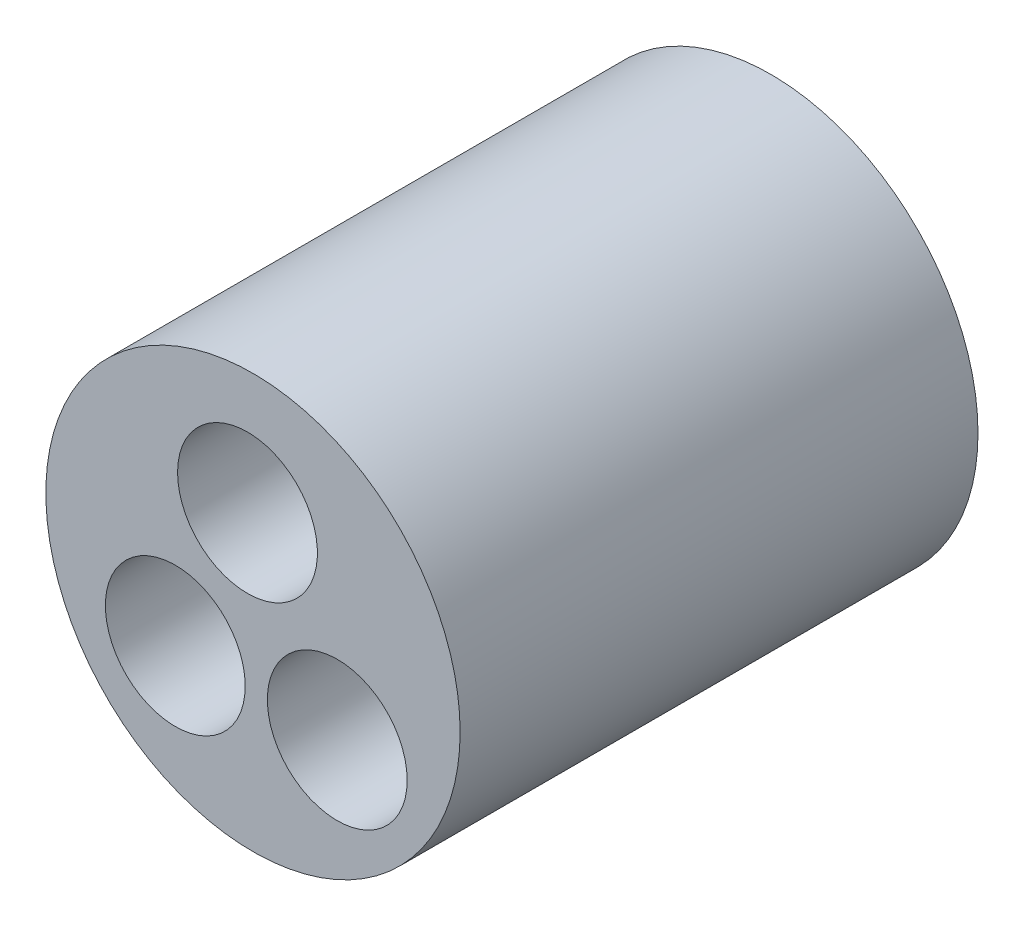
ISO-10303-21;
HEADER;
FILE_DESCRIPTION(('STEP AP214'),'2;1');
FILE_NAME('part.step','',(''),(''),'','','');
FILE_SCHEMA(('AUTOMOTIVE_DESIGN { 1 0 10303 214 1 1 1 1 }'));
ENDSEC;
DATA;
#1=APPLICATION_CONTEXT('core data for automotive mechanical design processes');
#2=APPLICATION_PROTOCOL_DEFINITION('international standard','automotive_design',2000,#1);
#3=PRODUCT_CONTEXT('',#1,'mechanical');
#4=PRODUCT('Part','Part','',(#3));
#5=PRODUCT_RELATED_PRODUCT_CATEGORY('part','',(#4));
#6=PRODUCT_DEFINITION_FORMATION('','',#4);
#7=PRODUCT_DEFINITION_CONTEXT('part definition',#1,'design');
#8=PRODUCT_DEFINITION('design','',#6,#7);
#9=PRODUCT_DEFINITION_SHAPE('','',#8);
#10=(LENGTH_UNIT() NAMED_UNIT(*) SI_UNIT(.MILLI.,.METRE.));
#11=(NAMED_UNIT(*) PLANE_ANGLE_UNIT() SI_UNIT($,.RADIAN.));
#12=(NAMED_UNIT(*) SI_UNIT($,.STERADIAN.) SOLID_ANGLE_UNIT());
#13=UNCERTAINTY_MEASURE_WITH_UNIT(LENGTH_MEASURE(1.E-05),#10,'distance_accuracy_value','');
#14=(GEOMETRIC_REPRESENTATION_CONTEXT(3) GLOBAL_UNCERTAINTY_ASSIGNED_CONTEXT((#13)) GLOBAL_UNIT_ASSIGNED_CONTEXT((#10,
#11,#12)) REPRESENTATION_CONTEXT('',''));
#15=CARTESIAN_POINT('',(0.,0.,0.));
#16=DIRECTION('',(0.,0.,1.));
#17=DIRECTION('',(1.,0.,0.));
#18=AXIS2_PLACEMENT_3D('',#15,#16,#17);
#19=CARTESIAN_POINT('',(7.5799606373721,0.,5.2));
#20=DIRECTION('',(0.,0.,-1.));
#21=DIRECTION('',(-1.,0.,0.));
#22=AXIS2_PLACEMENT_3D('',#19,#20,#21);
#23=CYLINDRICAL_SURFACE('',#22,2.75);
#24=CARTESIAN_POINT('',(7.5799606373721,0.,5.2));
#25=DIRECTION('',(0.,0.,-1.));
#26=DIRECTION('',(-1.,0.,0.));
#27=AXIS2_PLACEMENT_3D('',#24,#25,#26);
#28=CIRCLE('',#27,2.75);
#29=CARTESIAN_POINT('',(8.63379057536218,-2.54006741284475,5.2));
#30=VERTEX_POINT('',#29);
#31=CARTESIAN_POINT('',(6.57938547184493,-2.56151309544384,5.2));
#32=VERTEX_POINT('',#31);
#33=EDGE_CURVE('E129',#30,#32,#28,.T.);
#34=ORIENTED_EDGE('',*,*,#33,.F.);
#35=DIRECTION('',(0.,0.,1.));
#36=VECTOR('',#35,1.);
#37=CARTESIAN_POINT('',(8.63379057536218,-2.54006741284475,5.));
#38=LINE('',#37,#36);
#39=CARTESIAN_POINT('',(8.63379057536218,-2.54006741284475,0.));
#40=VERTEX_POINT('',#39);
#41=EDGE_CURVE('E113',#30,#40,#38,.F.);
#42=ORIENTED_EDGE('',*,*,#41,.T.);
#43=CARTESIAN_POINT('',(7.5799606373721,0.,0.));
#44=DIRECTION('',(0.,0.,-1.));
#45=DIRECTION('',(-1.,0.,0.));
#46=AXIS2_PLACEMENT_3D('',#43,#44,#45);
#47=CIRCLE('',#46,2.75);
#48=CARTESIAN_POINT('',(6.57938547184493,-2.56151309544384,0.));
#49=VERTEX_POINT('',#48);
#50=EDGE_CURVE('E122',#40,#49,#47,.T.);
#51=ORIENTED_EDGE('',*,*,#50,.T.);
#52=DIRECTION('',(0.,0.,1.));
#53=VECTOR('',#52,1.);
#54=CARTESIAN_POINT('',(6.57938547184493,-2.56151309544384,5.));
#55=LINE('',#54,#53);
#56=EDGE_CURVE('E165',#49,#32,#55,.T.);
#57=ORIENTED_EDGE('',*,*,#56,.T.);
#58=EDGE_LOOP('',(#34,#42,#51,#57));
#59=FACE_BOUND('',#58,.T.);
#60=ADVANCED_FACE('F33',(#59),#23,.F.);
#61=CARTESIAN_POINT('',(7.5799606373721,0.,5.2));
#62=DIRECTION('',(0.,0.,-1.));
#63=DIRECTION('',(-1.,0.,0.));
#64=AXIS2_PLACEMENT_3D('',#61,#62,#63);
#65=PLANE('',#64);
#66=CARTESIAN_POINT('',(9.20753202698421,-1.31805237746644,5.2));
#67=DIRECTION('',(0.,0.,-1.));
#68=DIRECTION('',(-1.,0.,0.));
#69=AXIS2_PLACEMENT_3D('',#66,#67,#68);
#70=CIRCLE('',#69,1.35);
#71=CARTESIAN_POINT('',(9.77793122812153,-0.0944737116905464,5.2));
#72=VERTEX_POINT('',#71);
#73=CARTESIAN_POINT('',(10.283598535764,-0.502834082356185,5.2));
#74=VERTEX_POINT('',#73);
#75=EDGE_CURVE('E108',#72,#74,#70,.T.);
#76=ORIENTED_EDGE('',*,*,#75,.F.);
#77=CARTESIAN_POINT('',(7.5799606373721,0.,5.2));
#78=DIRECTION('',(0.,0.,-1.));
#79=DIRECTION('',(-1.,0.,0.));
#80=AXIS2_PLACEMENT_3D('',#77,#78,#79);
#81=CIRCLE('',#80,2.2);
#82=CARTESIAN_POINT('',(5.38506632164342,-0.149796337678694,5.2));
#83=VERTEX_POINT('',#82);
#84=EDGE_CURVE('E177',#83,#72,#81,.T.);
#85=ORIENTED_EDGE('',*,*,#84,.F.);
#86=CARTESIAN_POINT('',(6.07959594488605,-1.30743557441804,5.2));
#87=DIRECTION('',(0.,0.,-1.));
#88=DIRECTION('',(-1.,0.,0.));
#89=AXIS2_PLACEMENT_3D('',#86,#87,#88);
#90=CIRCLE('',#89,1.35);
#91=CARTESIAN_POINT('',(4.90566473646909,-0.640813104121164,5.2));
#92=VERTEX_POINT('',#91);
#93=EDGE_CURVE('E164',#92,#83,#90,.T.);
#94=ORIENTED_EDGE('',*,*,#93,.F.);
#95=EDGE_CURVE('E131',#92,#74,#28,.T.);
#96=ORIENTED_EDGE('',*,*,#95,.T.);
#97=EDGE_LOOP('',(#76,#85,#94,#96));
#98=FACE_BOUND('',#97,.T.);
#99=ADVANCED_FACE('F221',(#98),#65,.T.);
#100=CARTESIAN_POINT('',(7.5799606373721,0.,6.2));
#101=DIRECTION('',(0.,0.,-1.));
#102=DIRECTION('',(-1.,0.,0.));
#103=AXIS2_PLACEMENT_3D('',#100,#101,#102);
#104=CYLINDRICAL_SURFACE('',#103,2.2);
#105=CARTESIAN_POINT('',(7.5799606373721,0.,6.2));
#106=DIRECTION('',(0.,0.,-1.));
#107=DIRECTION('',(-1.,0.,0.));
#108=AXIS2_PLACEMENT_3D('',#105,#106,#107);
#109=CIRCLE('',#108,2.2);
#110=CARTESIAN_POINT('',(8.12924131918393,-2.1303264380344,6.2));
#111=VERTEX_POINT('',#110);
#112=CARTESIAN_POINT('',(7.13135907884184,-2.15377729621338,6.2));
#113=VERTEX_POINT('',#112);
#114=EDGE_CURVE('E152',#111,#113,#109,.T.);
#115=ORIENTED_EDGE('',*,*,#114,.F.);
#116=DIRECTION('',(0.,0.,1.));
#117=VECTOR('',#116,1.);
#118=CARTESIAN_POINT('',(8.12924131918393,-2.1303264380344,5.));
#119=LINE('',#118,#117);
#120=CARTESIAN_POINT('',(8.12924131918393,-2.1303264380344,5.2));
#121=VERTEX_POINT('',#120);
#122=EDGE_CURVE('E47',#111,#121,#119,.F.);
#123=ORIENTED_EDGE('',*,*,#122,.T.);
#124=CARTESIAN_POINT('',(7.13135907884184,-2.15377729621338,5.2));
#125=VERTEX_POINT('',#124);
#126=EDGE_CURVE('E154',#121,#125,#81,.T.);
#127=ORIENTED_EDGE('',*,*,#126,.T.);
#128=DIRECTION('',(0.,0.,1.));
#129=VECTOR('',#128,1.);
#130=CARTESIAN_POINT('',(7.13135907884184,-2.15377729621338,5.));
#131=LINE('',#130,#129);
#132=EDGE_CURVE('E145',#125,#113,#131,.T.);
#133=ORIENTED_EDGE('',*,*,#132,.T.);
#134=EDGE_LOOP('',(#115,#123,#127,#133));
#135=FACE_BOUND('',#134,.T.);
#136=ADVANCED_FACE('F151',(#135),#104,.F.);
#137=CARTESIAN_POINT('',(7.5799606373721,0.,10.));
#138=DIRECTION('',(0.,0.,-1.));
#139=DIRECTION('',(-1.,0.,0.));
#140=AXIS2_PLACEMENT_3D('',#137,#138,#139);
#141=CYLINDRICAL_SURFACE('',#140,4.);
#142=CARTESIAN_POINT('',(7.5799606373721,0.,10.));
#143=DIRECTION('',(0.,0.,1.));
#144=DIRECTION('',(1.,0.,0.));
#145=AXIS2_PLACEMENT_3D('',#142,#143,#144);
#146=CIRCLE('',#145,4.);
#147=CARTESIAN_POINT('',(11.5799606373721,0.,10.));
#148=VERTEX_POINT('',#147);
#149=EDGE_CURVE('E136',#148,#148,#146,.T.);
#150=ORIENTED_EDGE('',*,*,#149,.F.);
#151=EDGE_LOOP('',(#150));
#152=FACE_BOUND('',#151,.T.);
#153=CARTESIAN_POINT('',(7.5799606373721,0.,0.));
#154=DIRECTION('',(0.,0.,1.));
#155=DIRECTION('',(1.,0.,0.));
#156=AXIS2_PLACEMENT_3D('',#153,#154,#155);
#157=CIRCLE('',#156,4.);
#158=CARTESIAN_POINT('',(11.5799606373721,0.,0.));
#159=VERTEX_POINT('',#158);
#160=EDGE_CURVE('E139',#159,#159,#157,.T.);
#161=ORIENTED_EDGE('',*,*,#160,.T.);
#162=EDGE_LOOP('',(#161));
#163=FACE_BOUND('',#162,.T.);
#164=ADVANCED_FACE('F35',(#152,#163),#141,.T.);
#165=CARTESIAN_POINT('',(7.5799606373721,0.,10.));
#166=DIRECTION('',(0.,0.,1.));
#167=DIRECTION('',(1.,0.,0.));
#168=AXIS2_PLACEMENT_3D('',#165,#166,#167);
#169=PLANE('',#168);
#170=CARTESIAN_POINT('',(9.20753202698421,-1.31805237746644,10.));
#171=DIRECTION('',(0.,0.,1.));
#172=DIRECTION('',(1.,0.,0.));
#173=AXIS2_PLACEMENT_3D('',#170,#171,#172);
#174=CIRCLE('',#173,1.35);
#175=CARTESIAN_POINT('',(10.5575320269842,-1.31805237746644,10.));
#176=VERTEX_POINT('',#175);
#177=EDGE_CURVE('E124',#176,#176,#174,.T.);
#178=ORIENTED_EDGE('',*,*,#177,.F.);
#179=EDGE_LOOP('',(#178));
#180=FACE_BOUND('',#179,.T.);
#181=CARTESIAN_POINT('',(6.07959594488605,-1.30743557441804,10.));
#182=DIRECTION('',(0.,0.,1.));
#183=DIRECTION('',(1.,0.,0.));
#184=AXIS2_PLACEMENT_3D('',#181,#182,#183);
#185=CIRCLE('',#184,1.35);
#186=CARTESIAN_POINT('',(7.42959594488605,-1.30743557441804,10.));
#187=VERTEX_POINT('',#186);
#188=EDGE_CURVE('E159',#187,#187,#185,.T.);
#189=ORIENTED_EDGE('',*,*,#188,.F.);
#190=EDGE_LOOP('',(#189));
#191=FACE_BOUND('',#190,.T.);
#192=CARTESIAN_POINT('',(7.47360329768658,1.61562642074773,10.));
#193=DIRECTION('',(0.,0.,-1.));
#194=DIRECTION('',(-1.,0.,0.));
#195=AXIS2_PLACEMENT_3D('',#192,#193,#194);
#196=CIRCLE('',#195,1.35);
#197=CARTESIAN_POINT('',(6.12360329768658,1.61562642074773,10.));
#198=VERTEX_POINT('',#197);
#199=EDGE_CURVE('E170',#198,#198,#196,.T.);
#200=ORIENTED_EDGE('',*,*,#199,.T.);
#201=EDGE_LOOP('',(#200));
#202=FACE_BOUND('',#201,.T.);
#203=ORIENTED_EDGE('',*,*,#149,.T.);
#204=EDGE_LOOP('',(#203));
#205=FACE_BOUND('',#204,.T.);
#206=ADVANCED_FACE('F202',(#180,#191,#202,#205),#169,.T.);
#207=CARTESIAN_POINT('',(7.5799606373721,0.,0.));
#208=DIRECTION('',(0.,0.,1.));
#209=DIRECTION('',(1.,0.,0.));
#210=AXIS2_PLACEMENT_3D('',#207,#208,#209);
#211=PLANE('',#210);
#212=ORIENTED_EDGE('',*,*,#50,.F.);
#213=CARTESIAN_POINT('',(9.20753202698421,-1.31805237746644,0.));
#214=DIRECTION('',(0.,0.,1.));
#215=DIRECTION('',(1.,0.,0.));
#216=AXIS2_PLACEMENT_3D('',#213,#214,#215);
#217=CIRCLE('',#216,1.35);
#218=CARTESIAN_POINT('',(10.283598535764,-0.502834082356185,0.));
#219=VERTEX_POINT('',#218);
#220=EDGE_CURVE('E105',#40,#219,#217,.T.);
#221=ORIENTED_EDGE('',*,*,#220,.T.);
#222=CARTESIAN_POINT('',(4.90566473646909,-0.640813104121164,0.));
#223=VERTEX_POINT('',#222);
#224=EDGE_CURVE('E121',#223,#219,#47,.T.);
#225=ORIENTED_EDGE('',*,*,#224,.F.);
#226=CARTESIAN_POINT('',(6.07959594488605,-1.30743557441804,0.));
#227=DIRECTION('',(0.,0.,1.));
#228=DIRECTION('',(1.,0.,0.));
#229=AXIS2_PLACEMENT_3D('',#226,#227,#228);
#230=CIRCLE('',#229,1.35);
#231=EDGE_CURVE('E155',#223,#49,#230,.T.);
#232=ORIENTED_EDGE('',*,*,#231,.T.);
#233=EDGE_LOOP('',(#212,#221,#225,#232));
#234=FACE_BOUND('',#233,.T.);
#235=ORIENTED_EDGE('',*,*,#160,.F.);
#236=EDGE_LOOP('',(#235));
#237=FACE_BOUND('',#236,.T.);
#238=ADVANCED_FACE('F118',(#234,#237),#211,.F.);
#239=ORIENTED_EDGE('',*,*,#224,.T.);
#240=DIRECTION('',(0.,0.,1.));
#241=VECTOR('',#240,1.);
#242=CARTESIAN_POINT('',(10.283598535764,-0.502834082356185,5.));
#243=LINE('',#242,#241);
#244=EDGE_CURVE('E102',#219,#74,#243,.T.);
#245=ORIENTED_EDGE('',*,*,#244,.T.);
#246=ORIENTED_EDGE('',*,*,#95,.F.);
#247=DIRECTION('',(0.,0.,1.));
#248=VECTOR('',#247,1.);
#249=CARTESIAN_POINT('',(4.90566473646909,-0.640813104121164,5.));
#250=LINE('',#249,#248);
#251=EDGE_CURVE('E128',#92,#223,#250,.F.);
#252=ORIENTED_EDGE('',*,*,#251,.T.);
#253=EDGE_LOOP('',(#239,#245,#246,#252));
#254=FACE_BOUND('',#253,.T.);
#255=ADVANCED_FACE('F127',(#254),#23,.F.);
#256=EDGE_CURVE('E191',#30,#121,#70,.T.);
#257=ORIENTED_EDGE('',*,*,#256,.F.);
#258=ORIENTED_EDGE('',*,*,#33,.T.);
#259=EDGE_CURVE('E157',#125,#32,#90,.T.);
#260=ORIENTED_EDGE('',*,*,#259,.F.);
#261=ORIENTED_EDGE('',*,*,#126,.F.);
#262=EDGE_LOOP('',(#257,#258,#260,#261));
#263=FACE_BOUND('',#262,.T.);
#264=ADVANCED_FACE('F218',(#263),#65,.T.);
#265=ORIENTED_EDGE('',*,*,#84,.T.);
#266=DIRECTION('',(0.,0.,1.));
#267=VECTOR('',#266,1.);
#268=CARTESIAN_POINT('',(9.77793122812153,-0.0944737116905469,5.));
#269=LINE('',#268,#267);
#270=CARTESIAN_POINT('',(9.77793122812153,-0.094473711690547,6.2));
#271=VERTEX_POINT('',#270);
#272=EDGE_CURVE('E123',#72,#271,#269,.T.);
#273=ORIENTED_EDGE('',*,*,#272,.T.);
#274=CARTESIAN_POINT('',(8.80711947662306,1.82594665399848,6.2));
#275=VERTEX_POINT('',#274);
#276=EDGE_CURVE('E176',#275,#271,#109,.T.);
#277=ORIENTED_EDGE('',*,*,#276,.F.);
#278=CARTESIAN_POINT('',(6.12402376343064,1.6493173797355,6.2));
#279=VERTEX_POINT('',#278);
#280=EDGE_CURVE('E133',#279,#275,#109,.T.);
#281=ORIENTED_EDGE('',*,*,#280,.F.);
#282=CARTESIAN_POINT('',(5.38506632164342,-0.149796337678693,6.2));
#283=VERTEX_POINT('',#282);
#284=EDGE_CURVE('E179',#283,#279,#109,.T.);
#285=ORIENTED_EDGE('',*,*,#284,.F.);
#286=DIRECTION('',(0.,0.,1.));
#287=VECTOR('',#286,1.);
#288=CARTESIAN_POINT('',(5.38506632164342,-0.149796337678693,5.));
#289=LINE('',#288,#287);
#290=EDGE_CURVE('E55',#283,#83,#289,.F.);
#291=ORIENTED_EDGE('',*,*,#290,.T.);
#292=EDGE_LOOP('',(#265,#273,#277,#281,#285,#291));
#293=FACE_BOUND('',#292,.T.);
#294=ADVANCED_FACE('F189',(#293),#104,.F.);
#295=CARTESIAN_POINT('',(7.5799606373721,0.,6.2));
#296=DIRECTION('',(0.,0.,-1.));
#297=DIRECTION('',(-1.,0.,0.));
#298=AXIS2_PLACEMENT_3D('',#295,#296,#297);
#299=PLANE('',#298);
#300=CARTESIAN_POINT('',(9.20753202698421,-1.31805237746644,6.2));
#301=DIRECTION('',(0.,0.,-1.));
#302=DIRECTION('',(-1.,0.,0.));
#303=AXIS2_PLACEMENT_3D('',#300,#301,#302);
#304=CIRCLE('',#303,1.35);
#305=EDGE_CURVE('E11',#111,#271,#304,.T.);
#306=ORIENTED_EDGE('',*,*,#305,.F.);
#307=ORIENTED_EDGE('',*,*,#114,.T.);
#308=CARTESIAN_POINT('',(6.07959594488605,-1.30743557441804,6.2));
#309=DIRECTION('',(0.,0.,-1.));
#310=DIRECTION('',(-1.,0.,0.));
#311=AXIS2_PLACEMENT_3D('',#308,#309,#310);
#312=CIRCLE('',#311,1.35);
#313=EDGE_CURVE('E41',#283,#113,#312,.T.);
#314=ORIENTED_EDGE('',*,*,#313,.F.);
#315=ORIENTED_EDGE('',*,*,#284,.T.);
#316=CARTESIAN_POINT('',(7.47360329768658,1.61562642074773,6.2));
#317=DIRECTION('',(0.,0.,-1.));
#318=DIRECTION('',(-1.,0.,0.));
#319=AXIS2_PLACEMENT_3D('',#316,#317,#318);
#320=CIRCLE('',#319,1.35);
#321=EDGE_CURVE('E169',#275,#279,#320,.T.);
#322=ORIENTED_EDGE('',*,*,#321,.F.);
#323=ORIENTED_EDGE('',*,*,#276,.T.);
#324=EDGE_LOOP('',(#306,#307,#314,#315,#322,#323));
#325=FACE_BOUND('',#324,.T.);
#326=ADVANCED_FACE('F187',(#325),#299,.T.);
#327=CARTESIAN_POINT('',(7.47360329768658,1.61562642074773,10.));
#328=DIRECTION('',(0.,0.,-1.));
#329=DIRECTION('',(-1.,0.,0.));
#330=AXIS2_PLACEMENT_3D('',#327,#328,#329);
#331=CYLINDRICAL_SURFACE('',#330,1.35);
#332=ORIENTED_EDGE('',*,*,#199,.F.);
#333=EDGE_LOOP('',(#332));
#334=FACE_BOUND('',#333,.T.);
#335=EDGE_CURVE('E173',#279,#275,#320,.T.);
#336=ORIENTED_EDGE('',*,*,#335,.T.);
#337=ORIENTED_EDGE('',*,*,#321,.T.);
#338=EDGE_LOOP('',(#336,#337));
#339=FACE_BOUND('',#338,.T.);
#340=ADVANCED_FACE('F234',(#334,#339),#331,.F.);
#341=CARTESIAN_POINT('',(7.47360329768658,1.61562642074773,6.2));
#342=DIRECTION('',(0.,0.,-1.));
#343=DIRECTION('',(-1.,0.,0.));
#344=AXIS2_PLACEMENT_3D('',#341,#342,#343);
#345=PLANE('',#344);
#346=ORIENTED_EDGE('',*,*,#280,.T.);
#347=ORIENTED_EDGE('',*,*,#335,.F.);
#348=EDGE_LOOP('',(#346,#347));
#349=FACE_BOUND('',#348,.T.);
#350=ADVANCED_FACE('F237',(#349),#345,.F.);
#351=CARTESIAN_POINT('',(6.07959594488605,-1.30743557441804,0.));
#352=DIRECTION('',(0.,0.,1.));
#353=DIRECTION('',(1.,0.,0.));
#354=AXIS2_PLACEMENT_3D('',#351,#352,#353);
#355=CYLINDRICAL_SURFACE('',#354,1.35);
#356=ORIENTED_EDGE('',*,*,#188,.T.);
#357=EDGE_LOOP('',(#356));
#358=FACE_BOUND('',#357,.T.);
#359=ORIENTED_EDGE('',*,*,#93,.T.);
#360=ORIENTED_EDGE('',*,*,#290,.F.);
#361=ORIENTED_EDGE('',*,*,#313,.T.);
#362=ORIENTED_EDGE('',*,*,#132,.F.);
#363=ORIENTED_EDGE('',*,*,#259,.T.);
#364=ORIENTED_EDGE('',*,*,#56,.F.);
#365=ORIENTED_EDGE('',*,*,#231,.F.);
#366=ORIENTED_EDGE('',*,*,#251,.F.);
#367=EDGE_LOOP('',(#359,#360,#361,#362,#363,#364,#365,#366));
#368=FACE_BOUND('',#367,.T.);
#369=ADVANCED_FACE('F143',(#358,#368),#355,.F.);
#370=CARTESIAN_POINT('',(9.20753202698421,-1.31805237746644,0.));
#371=DIRECTION('',(0.,0.,1.));
#372=DIRECTION('',(1.,0.,0.));
#373=AXIS2_PLACEMENT_3D('',#370,#371,#372);
#374=CYLINDRICAL_SURFACE('',#373,1.35);
#375=ORIENTED_EDGE('',*,*,#177,.T.);
#376=EDGE_LOOP('',(#375));
#377=FACE_BOUND('',#376,.T.);
#378=ORIENTED_EDGE('',*,*,#256,.T.);
#379=ORIENTED_EDGE('',*,*,#122,.F.);
#380=ORIENTED_EDGE('',*,*,#305,.T.);
#381=ORIENTED_EDGE('',*,*,#272,.F.);
#382=ORIENTED_EDGE('',*,*,#75,.T.);
#383=ORIENTED_EDGE('',*,*,#244,.F.);
#384=ORIENTED_EDGE('',*,*,#220,.F.);
#385=ORIENTED_EDGE('',*,*,#41,.F.);
#386=EDGE_LOOP('',(#378,#379,#380,#381,#382,#383,#384,#385));
#387=FACE_BOUND('',#386,.T.);
#388=ADVANCED_FACE('F104',(#377,#387),#374,.F.);
#389=CLOSED_SHELL('',(#60,#99,#136,#164,#206,#238,#255,#264,#294,#326,#340,#350,#369,#388));
#390=MANIFOLD_SOLID_BREP('B2',#389);
#391=ADVANCED_BREP_SHAPE_REPRESENTATION('',(#18,#390),#14);
#392=SHAPE_DEFINITION_REPRESENTATION(#9,#391);
ENDSEC;
END-ISO-10303-21;
